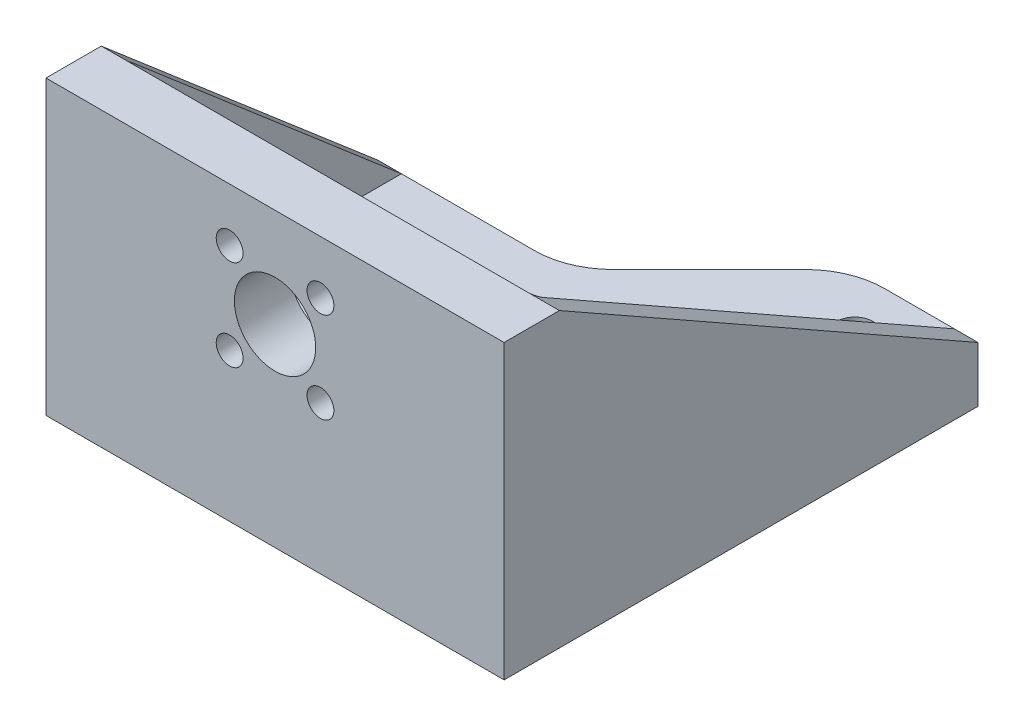
ISO-10303-21;
HEADER;
FILE_DESCRIPTION(('STEP AP214'),'2;1');
FILE_NAME('part.step','',(''),(''),'','','');
FILE_SCHEMA(('AUTOMOTIVE_DESIGN { 1 0 10303 214 1 1 1 1 }'));
ENDSEC;
DATA;
#1=APPLICATION_CONTEXT('core data for automotive mechanical design processes');
#2=APPLICATION_PROTOCOL_DEFINITION('international standard','automotive_design',2000,#1);
#3=PRODUCT_CONTEXT('',#1,'mechanical');
#4=PRODUCT('Part','Part','',(#3));
#5=PRODUCT_RELATED_PRODUCT_CATEGORY('part','',(#4));
#6=PRODUCT_DEFINITION_FORMATION('','',#4);
#7=PRODUCT_DEFINITION_CONTEXT('part definition',#1,'design');
#8=PRODUCT_DEFINITION('design','',#6,#7);
#9=PRODUCT_DEFINITION_SHAPE('','',#8);
#10=(LENGTH_UNIT() NAMED_UNIT(*) SI_UNIT(.MILLI.,.METRE.));
#11=(NAMED_UNIT(*) PLANE_ANGLE_UNIT() SI_UNIT($,.RADIAN.));
#12=(NAMED_UNIT(*) SI_UNIT($,.STERADIAN.) SOLID_ANGLE_UNIT());
#13=UNCERTAINTY_MEASURE_WITH_UNIT(LENGTH_MEASURE(1.E-05),#10,'distance_accuracy_value','');
#14=(GEOMETRIC_REPRESENTATION_CONTEXT(3) GLOBAL_UNCERTAINTY_ASSIGNED_CONTEXT((#13)) GLOBAL_UNIT_ASSIGNED_CONTEXT((#10,
#11,#12)) REPRESENTATION_CONTEXT('',''));
#15=CARTESIAN_POINT('',(0.,0.,0.));
#16=DIRECTION('',(0.,0.,1.));
#17=DIRECTION('',(1.,0.,0.));
#18=AXIS2_PLACEMENT_3D('',#15,#16,#17);
#19=CARTESIAN_POINT('',(0.,7.,0.));
#20=DIRECTION('',(0.,-1.,0.));
#21=DIRECTION('',(0.,0.,-1.));
#22=AXIS2_PLACEMENT_3D('',#19,#20,#21);
#23=PLANE('',#22);
#24=CARTESIAN_POINT('',(8.99999999999999,7.,-33.4));
#25=DIRECTION('',(0.,1.,0.));
#26=DIRECTION('',(0.,0.,1.));
#27=AXIS2_PLACEMENT_3D('',#24,#25,#26);
#28=CIRCLE('',#27,2.25);
#29=CARTESIAN_POINT('',(8.99999999999999,7.,-31.15));
#30=VERTEX_POINT('',#29);
#31=EDGE_CURVE('E655',#30,#30,#28,.T.);
#32=ORIENTED_EDGE('',*,*,#31,.F.);
#33=EDGE_LOOP('',(#32));
#34=FACE_BOUND('',#33,.T.);
#35=CARTESIAN_POINT('',(49.,7.,-13.4));
#36=DIRECTION('',(0.,1.,0.));
#37=DIRECTION('',(0.,0.,1.));
#38=AXIS2_PLACEMENT_3D('',#35,#36,#37);
#39=CIRCLE('',#38,2.25);
#40=CARTESIAN_POINT('',(49.,7.,-11.15));
#41=VERTEX_POINT('',#40);
#42=EDGE_CURVE('E647',#41,#41,#39,.T.);
#43=ORIENTED_EDGE('',*,*,#42,.F.);
#44=EDGE_LOOP('',(#43));
#45=FACE_BOUND('',#44,.T.);
#46=CARTESIAN_POINT('',(49.,7.,-53.4));
#47=DIRECTION('',(0.,1.,0.));
#48=DIRECTION('',(0.,0.,1.));
#49=AXIS2_PLACEMENT_3D('',#46,#47,#48);
#50=CIRCLE('',#49,2.25);
#51=CARTESIAN_POINT('',(49.,7.,-51.15));
#52=VERTEX_POINT('',#51);
#53=EDGE_CURVE('E639',#52,#52,#50,.T.);
#54=ORIENTED_EDGE('',*,*,#53,.F.);
#55=EDGE_LOOP('',(#54));
#56=FACE_BOUND('',#55,.T.);
#57=DIRECTION('',(0.,0.,1.));
#58=VECTOR('',#57,1.);
#59=CARTESIAN_POINT('',(3.,7.,-7.00000000000001));
#60=LINE('',#59,#58);
#61=CARTESIAN_POINT('',(3.,7.,-42.));
#62=VERTEX_POINT('',#61);
#63=CARTESIAN_POINT('',(3.,7.,-8.00000000000001));
#64=VERTEX_POINT('',#63);
#65=EDGE_CURVE('E151',#62,#64,#60,.T.);
#66=ORIENTED_EDGE('',*,*,#65,.T.);
#67=DIRECTION('',(-1.,0.,0.));
#68=VECTOR('',#67,1.);
#69=CARTESIAN_POINT('',(55.,7.,-8.));
#70=LINE('',#69,#68);
#71=CARTESIAN_POINT('',(55.,7.,-8.));
#72=VERTEX_POINT('',#71);
#73=EDGE_CURVE('E251',#64,#72,#70,.F.);
#74=ORIENTED_EDGE('',*,*,#73,.T.);
#75=DIRECTION('',(0.,0.,-1.));
#76=VECTOR('',#75,1.);
#77=CARTESIAN_POINT('',(55.,7.,-7.));
#78=LINE('',#77,#76);
#79=CARTESIAN_POINT('',(55.,7.,-60.));
#80=VERTEX_POINT('',#79);
#81=EDGE_CURVE('E291',#72,#80,#78,.T.);
#82=ORIENTED_EDGE('',*,*,#81,.T.);
#83=DIRECTION('',(-1.,0.,0.));
#84=VECTOR('',#83,1.);
#85=CARTESIAN_POINT('',(0.,7.,-60.));
#86=LINE('',#85,#84);
#87=CARTESIAN_POINT('',(46.142135623731,7.,-60.));
#88=VERTEX_POINT('',#87);
#89=EDGE_CURVE('E190',#80,#88,#86,.T.);
#90=ORIENTED_EDGE('',*,*,#89,.T.);
#91=CARTESIAN_POINT('',(46.142135623731,7.,-50.));
#92=DIRECTION('',(0.,-1.,0.));
#93=DIRECTION('',(0.,0.,-1.));
#94=AXIS2_PLACEMENT_3D('',#91,#92,#93);
#95=CIRCLE('',#94,10.);
#96=CARTESIAN_POINT('',(39.0710678118655,7.,-57.0710678118654));
#97=VERTEX_POINT('',#96);
#98=EDGE_CURVE('E216',#88,#97,#95,.F.);
#99=ORIENTED_EDGE('',*,*,#98,.T.);
#100=DIRECTION('',(0.707106781186541,0.,-0.707106781186554));
#101=VECTOR('',#100,1.);
#102=CARTESIAN_POINT('',(42.,7.,-60.));
#103=LINE('',#102,#101);
#104=CARTESIAN_POINT('',(26.9289321881349,7.,-44.9289321881346));
#105=VERTEX_POINT('',#104);
#106=EDGE_CURVE('E622',#105,#97,#103,.T.);
#107=ORIENTED_EDGE('',*,*,#106,.F.);
#108=CARTESIAN_POINT('',(19.8578643762693,7.,-52.));
#109=DIRECTION('',(0.,-1.,0.));
#110=DIRECTION('',(0.,0.,-1.));
#111=AXIS2_PLACEMENT_3D('',#108,#109,#110);
#112=CIRCLE('',#111,10.);
#113=CARTESIAN_POINT('',(19.8578643762693,7.,-42.));
#114=VERTEX_POINT('',#113);
#115=EDGE_CURVE('E232',#105,#114,#112,.T.);
#116=ORIENTED_EDGE('',*,*,#115,.T.);
#117=DIRECTION('',(1.,0.,0.));
#118=VECTOR('',#117,1.);
#119=CARTESIAN_POINT('',(24.0000000000003,7.,-42.));
#120=LINE('',#119,#118);
#121=EDGE_CURVE('E160',#62,#114,#120,.T.);
#122=ORIENTED_EDGE('',*,*,#121,.F.);
#123=EDGE_LOOP('',(#66,#74,#82,#90,#99,#107,#116,#122));
#124=FACE_BOUND('',#123,.T.);
#125=ADVANCED_FACE('F40',(#34,#45,#56,#124),#23,.F.);
#126=CARTESIAN_POINT('',(0.,37.,-7.00000000000001));
#127=DIRECTION('',(0.,0.,1.));
#128=DIRECTION('',(1.,0.,0.));
#129=AXIS2_PLACEMENT_3D('',#126,#127,#128);
#130=PLANE('',#129);
#131=CARTESIAN_POINT('',(29.,24.5,-7.00000000000001));
#132=DIRECTION('',(0.,0.,-1.));
#133=DIRECTION('',(-1.,0.,0.));
#134=AXIS2_PLACEMENT_3D('',#131,#132,#133);
#135=CIRCLE('',#134,5.15);
#136=CARTESIAN_POINT('',(23.85,24.5,-7.00000000000001));
#137=VERTEX_POINT('',#136);
#138=EDGE_CURVE('E176',#137,#137,#135,.T.);
#139=ORIENTED_EDGE('',*,*,#138,.F.);
#140=EDGE_LOOP('',(#139));
#141=FACE_BOUND('',#140,.T.);
#142=CARTESIAN_POINT('',(34.75,30.25,-7.00000000000001));
#143=DIRECTION('',(0.,0.,-1.));
#144=DIRECTION('',(-1.,0.,0.));
#145=AXIS2_PLACEMENT_3D('',#142,#143,#144);
#146=CIRCLE('',#145,1.7);
#147=CARTESIAN_POINT('',(33.05,30.25,-7.00000000000001));
#148=VERTEX_POINT('',#147);
#149=EDGE_CURVE('E324',#148,#148,#146,.T.);
#150=ORIENTED_EDGE('',*,*,#149,.F.);
#151=EDGE_LOOP('',(#150));
#152=FACE_BOUND('',#151,.T.);
#153=CARTESIAN_POINT('',(23.25,30.25,-7.00000000000001));
#154=DIRECTION('',(0.,0.,-1.));
#155=DIRECTION('',(-1.,0.,0.));
#156=AXIS2_PLACEMENT_3D('',#153,#154,#155);
#157=CIRCLE('',#156,1.7);
#158=CARTESIAN_POINT('',(21.55,30.25,-7.00000000000001));
#159=VERTEX_POINT('',#158);
#160=EDGE_CURVE('E316',#159,#159,#157,.T.);
#161=ORIENTED_EDGE('',*,*,#160,.F.);
#162=EDGE_LOOP('',(#161));
#163=FACE_BOUND('',#162,.T.);
#164=CARTESIAN_POINT('',(23.25,18.75,-7.00000000000001));
#165=DIRECTION('',(0.,0.,-1.));
#166=DIRECTION('',(-1.,0.,0.));
#167=AXIS2_PLACEMENT_3D('',#164,#165,#166);
#168=CIRCLE('',#167,1.7);
#169=CARTESIAN_POINT('',(21.55,18.75,-7.00000000000001));
#170=VERTEX_POINT('',#169);
#171=EDGE_CURVE('E308',#170,#170,#168,.T.);
#172=ORIENTED_EDGE('',*,*,#171,.F.);
#173=EDGE_LOOP('',(#172));
#174=FACE_BOUND('',#173,.T.);
#175=CARTESIAN_POINT('',(34.75,18.75,-7.00000000000001));
#176=DIRECTION('',(0.,0.,-1.));
#177=DIRECTION('',(-1.,0.,0.));
#178=AXIS2_PLACEMENT_3D('',#175,#176,#177);
#179=CIRCLE('',#178,1.7);
#180=CARTESIAN_POINT('',(33.05,18.75,-7.00000000000001));
#181=VERTEX_POINT('',#180);
#182=EDGE_CURVE('E290',#181,#181,#179,.T.);
#183=ORIENTED_EDGE('',*,*,#182,.F.);
#184=EDGE_LOOP('',(#183));
#185=FACE_BOUND('',#184,.T.);
#186=DIRECTION('',(-1.,0.,0.));
#187=VECTOR('',#186,1.);
#188=CARTESIAN_POINT('',(0.,37.,-7.00000000000001));
#189=LINE('',#188,#187);
#190=CARTESIAN_POINT('',(54.,37.,-7.));
#191=VERTEX_POINT('',#190);
#192=CARTESIAN_POINT('',(4.,37.,-7.00000000000001));
#193=VERTEX_POINT('',#192);
#194=EDGE_CURVE('E157',#191,#193,#189,.T.);
#195=ORIENTED_EDGE('',*,*,#194,.F.);
#196=DIRECTION('',(0.,-1.,0.));
#197=VECTOR('',#196,1.);
#198=CARTESIAN_POINT('',(54.,37.,-7.));
#199=LINE('',#198,#197);
#200=CARTESIAN_POINT('',(54.,8.,-7.));
#201=VERTEX_POINT('',#200);
#202=EDGE_CURVE('E244',#191,#201,#199,.T.);
#203=ORIENTED_EDGE('',*,*,#202,.T.);
#204=DIRECTION('',(-1.,0.,0.));
#205=VECTOR('',#204,1.);
#206=CARTESIAN_POINT('',(3.,8.,-7.00000000000001));
#207=LINE('',#206,#205);
#208=CARTESIAN_POINT('',(4.,8.,-7.00000000000001));
#209=VERTEX_POINT('',#208);
#210=EDGE_CURVE('E241',#201,#209,#207,.T.);
#211=ORIENTED_EDGE('',*,*,#210,.T.);
#212=DIRECTION('',(0.,1.,0.));
#213=VECTOR('',#212,1.);
#214=CARTESIAN_POINT('',(4.,37.,-7.00000000000001));
#215=LINE('',#214,#213);
#216=EDGE_CURVE('E238',#209,#193,#215,.T.);
#217=ORIENTED_EDGE('',*,*,#216,.T.);
#218=EDGE_LOOP('',(#195,#203,#211,#217));
#219=FACE_BOUND('',#218,.T.);
#220=ADVANCED_FACE('F276',(#141,#152,#163,#174,#185,#219),#130,.F.);
#221=CARTESIAN_POINT('',(0.,7.,0.));
#222=DIRECTION('',(1.,0.,0.));
#223=DIRECTION('',(0.,0.,-1.));
#224=AXIS2_PLACEMENT_3D('',#221,#222,#223);
#225=PLANE('',#224);
#226=DIRECTION('',(0.,-0.650791373455969,-0.759256602365296));
#227=VECTOR('',#226,1.);
#228=CARTESIAN_POINT('',(0.,7.,-42.));
#229=LINE('',#228,#227);
#230=CARTESIAN_POINT('',(0.,37.,-7.00000000000001));
#231=VERTEX_POINT('',#230);
#232=CARTESIAN_POINT('',(0.,7.,-42.));
#233=VERTEX_POINT('',#232);
#234=EDGE_CURVE('E139',#231,#233,#229,.T.);
#235=ORIENTED_EDGE('',*,*,#234,.T.);
#236=DIRECTION('',(0.,1.,0.));
#237=VECTOR('',#236,1.);
#238=CARTESIAN_POINT('',(0.,0.,-42.));
#239=LINE('',#238,#237);
#240=CARTESIAN_POINT('',(0.,0.,-42.));
#241=VERTEX_POINT('',#240);
#242=EDGE_CURVE('E636',#241,#233,#239,.T.);
#243=ORIENTED_EDGE('',*,*,#242,.F.);
#244=DIRECTION('',(0.,0.,1.));
#245=VECTOR('',#244,1.);
#246=CARTESIAN_POINT('',(0.,0.,0.));
#247=LINE('',#246,#245);
#248=CARTESIAN_POINT('',(0.,0.,0.));
#249=VERTEX_POINT('',#248);
#250=EDGE_CURVE('E184',#241,#249,#247,.T.);
#251=ORIENTED_EDGE('',*,*,#250,.T.);
#252=DIRECTION('',(0.,-1.,0.));
#253=VECTOR('',#252,1.);
#254=CARTESIAN_POINT('',(0.,7.,0.));
#255=LINE('',#254,#253);
#256=CARTESIAN_POINT('',(0.,37.,0.));
#257=VERTEX_POINT('',#256);
#258=EDGE_CURVE('E165',#257,#249,#255,.T.);
#259=ORIENTED_EDGE('',*,*,#258,.F.);
#260=DIRECTION('',(0.,0.,1.));
#261=VECTOR('',#260,1.);
#262=CARTESIAN_POINT('',(0.,37.,-7.00000000000001));
#263=LINE('',#262,#261);
#264=EDGE_CURVE('E156',#231,#257,#263,.T.);
#265=ORIENTED_EDGE('',*,*,#264,.F.);
#266=EDGE_LOOP('',(#235,#243,#251,#259,#265));
#267=FACE_BOUND('',#266,.T.);
#268=ADVANCED_FACE('F163',(#267),#225,.F.);
#269=CARTESIAN_POINT('',(0.,7.,0.));
#270=DIRECTION('',(0.,0.,-1.));
#271=DIRECTION('',(-1.,0.,0.));
#272=AXIS2_PLACEMENT_3D('',#269,#270,#271);
#273=PLANE('',#272);
#274=CARTESIAN_POINT('',(34.75,18.75,0.));
#275=DIRECTION('',(0.,0.,-1.));
#276=DIRECTION('',(-1.,0.,0.));
#277=AXIS2_PLACEMENT_3D('',#274,#275,#276);
#278=CIRCLE('',#277,1.7);
#279=CARTESIAN_POINT('',(33.05,18.75,0.));
#280=VERTEX_POINT('',#279);
#281=EDGE_CURVE('E296',#280,#280,#278,.T.);
#282=ORIENTED_EDGE('',*,*,#281,.T.);
#283=EDGE_LOOP('',(#282));
#284=FACE_BOUND('',#283,.T.);
#285=CARTESIAN_POINT('',(23.25,18.75,0.));
#286=DIRECTION('',(0.,0.,-1.));
#287=DIRECTION('',(-1.,0.,0.));
#288=AXIS2_PLACEMENT_3D('',#285,#286,#287);
#289=CIRCLE('',#288,1.7);
#290=CARTESIAN_POINT('',(21.55,18.75,0.));
#291=VERTEX_POINT('',#290);
#292=EDGE_CURVE('E312',#291,#291,#289,.T.);
#293=ORIENTED_EDGE('',*,*,#292,.T.);
#294=EDGE_LOOP('',(#293));
#295=FACE_BOUND('',#294,.T.);
#296=CARTESIAN_POINT('',(23.25,30.25,0.));
#297=DIRECTION('',(0.,0.,-1.));
#298=DIRECTION('',(-1.,0.,0.));
#299=AXIS2_PLACEMENT_3D('',#296,#297,#298);
#300=CIRCLE('',#299,1.7);
#301=CARTESIAN_POINT('',(21.55,30.25,0.));
#302=VERTEX_POINT('',#301);
#303=EDGE_CURVE('E320',#302,#302,#300,.T.);
#304=ORIENTED_EDGE('',*,*,#303,.T.);
#305=EDGE_LOOP('',(#304));
#306=FACE_BOUND('',#305,.T.);
#307=CARTESIAN_POINT('',(34.75,30.25,0.));
#308=DIRECTION('',(0.,0.,-1.));
#309=DIRECTION('',(-1.,0.,0.));
#310=AXIS2_PLACEMENT_3D('',#307,#308,#309);
#311=CIRCLE('',#310,1.7);
#312=CARTESIAN_POINT('',(33.05,30.25,0.));
#313=VERTEX_POINT('',#312);
#314=EDGE_CURVE('E328',#313,#313,#311,.T.);
#315=ORIENTED_EDGE('',*,*,#314,.T.);
#316=EDGE_LOOP('',(#315));
#317=FACE_BOUND('',#316,.T.);
#318=CARTESIAN_POINT('',(29.,24.5,0.));
#319=DIRECTION('',(0.,0.,-1.));
#320=DIRECTION('',(-1.,0.,0.));
#321=AXIS2_PLACEMENT_3D('',#318,#319,#320);
#322=CIRCLE('',#321,5.15);
#323=CARTESIAN_POINT('',(23.85,24.5,0.));
#324=VERTEX_POINT('',#323);
#325=EDGE_CURVE('E169',#324,#324,#322,.T.);
#326=ORIENTED_EDGE('',*,*,#325,.T.);
#327=EDGE_LOOP('',(#326));
#328=FACE_BOUND('',#327,.T.);
#329=DIRECTION('',(1.,0.,0.));
#330=VECTOR('',#329,1.);
#331=CARTESIAN_POINT('',(0.,0.,0.));
#332=LINE('',#331,#330);
#333=CARTESIAN_POINT('',(58.,0.,0.));
#334=VERTEX_POINT('',#333);
#335=EDGE_CURVE('E193',#249,#334,#332,.T.);
#336=ORIENTED_EDGE('',*,*,#335,.T.);
#337=DIRECTION('',(0.,-1.,0.));
#338=VECTOR('',#337,1.);
#339=CARTESIAN_POINT('',(58.,7.,0.));
#340=LINE('',#339,#338);
#341=CARTESIAN_POINT('',(58.,37.,0.));
#342=VERTEX_POINT('',#341);
#343=EDGE_CURVE('E206',#342,#334,#340,.T.);
#344=ORIENTED_EDGE('',*,*,#343,.F.);
#345=DIRECTION('',(1.,0.,0.));
#346=VECTOR('',#345,1.);
#347=CARTESIAN_POINT('',(0.,37.,0.));
#348=LINE('',#347,#346);
#349=EDGE_CURVE('E168',#257,#342,#348,.T.);
#350=ORIENTED_EDGE('',*,*,#349,.F.);
#351=ORIENTED_EDGE('',*,*,#258,.T.);
#352=EDGE_LOOP('',(#336,#344,#350,#351));
#353=FACE_BOUND('',#352,.T.);
#354=ADVANCED_FACE('F385',(#284,#295,#306,#317,#328,#353),#273,.F.);
#355=CARTESIAN_POINT('',(58.,7.,0.));
#356=DIRECTION('',(-1.,0.,0.));
#357=DIRECTION('',(0.,0.,1.));
#358=AXIS2_PLACEMENT_3D('',#355,#356,#357);
#359=PLANE('',#358);
#360=DIRECTION('',(0.,-1.,0.));
#361=VECTOR('',#360,1.);
#362=CARTESIAN_POINT('',(58.,7.,-60.));
#363=LINE('',#362,#361);
#364=CARTESIAN_POINT('',(58.,7.,-60.));
#365=VERTEX_POINT('',#364);
#366=CARTESIAN_POINT('',(58.,0.,-60.));
#367=VERTEX_POINT('',#366);
#368=EDGE_CURVE('E189',#365,#367,#363,.T.);
#369=ORIENTED_EDGE('',*,*,#368,.F.);
#370=DIRECTION('',(0.,0.49259821985177,0.87025685507146));
#371=VECTOR('',#370,1.);
#372=CARTESIAN_POINT('',(58.,7.,-60.));
#373=LINE('',#372,#371);
#374=CARTESIAN_POINT('',(58.,37.,-7.));
#375=VERTEX_POINT('',#374);
#376=EDGE_CURVE('E298',#365,#375,#373,.T.);
#377=ORIENTED_EDGE('',*,*,#376,.T.);
#378=DIRECTION('',(0.,0.,-1.));
#379=VECTOR('',#378,1.);
#380=CARTESIAN_POINT('',(58.,37.,-7.));
#381=LINE('',#380,#379);
#382=EDGE_CURVE('E173',#342,#375,#381,.T.);
#383=ORIENTED_EDGE('',*,*,#382,.F.);
#384=ORIENTED_EDGE('',*,*,#343,.T.);
#385=DIRECTION('',(0.,0.,-1.));
#386=VECTOR('',#385,1.);
#387=CARTESIAN_POINT('',(58.,0.,0.));
#388=LINE('',#387,#386);
#389=EDGE_CURVE('E196',#334,#367,#388,.T.);
#390=ORIENTED_EDGE('',*,*,#389,.T.);
#391=EDGE_LOOP('',(#369,#377,#383,#384,#390));
#392=FACE_BOUND('',#391,.T.);
#393=ADVANCED_FACE('F381',(#392),#359,.F.);
#394=CARTESIAN_POINT('',(0.,7.,-60.));
#395=DIRECTION('',(0.,0.,1.));
#396=DIRECTION('',(1.,0.,0.));
#397=AXIS2_PLACEMENT_3D('',#394,#395,#396);
#398=PLANE('',#397);
#399=DIRECTION('',(-1.,0.,0.));
#400=VECTOR('',#399,1.);
#401=CARTESIAN_POINT('',(0.,0.,-60.));
#402=LINE('',#401,#400);
#403=CARTESIAN_POINT('',(46.142135623731,0.,-60.));
#404=VERTEX_POINT('',#403);
#405=EDGE_CURVE('E199',#367,#404,#402,.T.);
#406=ORIENTED_EDGE('',*,*,#405,.T.);
#407=DIRECTION('',(0.,1.,0.));
#408=VECTOR('',#407,1.);
#409=CARTESIAN_POINT('',(46.142135623731,7.,-60.));
#410=LINE('',#409,#408);
#411=EDGE_CURVE('E212',#404,#88,#410,.T.);
#412=ORIENTED_EDGE('',*,*,#411,.T.);
#413=ORIENTED_EDGE('',*,*,#89,.F.);
#414=EDGE_CURVE('E185',#365,#80,#86,.T.);
#415=ORIENTED_EDGE('',*,*,#414,.F.);
#416=ORIENTED_EDGE('',*,*,#368,.T.);
#417=EDGE_LOOP('',(#406,#412,#413,#415,#416));
#418=FACE_BOUND('',#417,.T.);
#419=ADVANCED_FACE('F377',(#418),#398,.F.);
#420=CARTESIAN_POINT('',(0.,0.,0.));
#421=DIRECTION('',(0.,-1.,0.));
#422=DIRECTION('',(0.,0.,-1.));
#423=AXIS2_PLACEMENT_3D('',#420,#421,#422);
#424=PLANE('',#423);
#425=DIRECTION('',(0.707106781186541,0.,-0.707106781186554));
#426=VECTOR('',#425,1.);
#427=CARTESIAN_POINT('',(42.,0.,-60.));
#428=LINE('',#427,#426);
#429=CARTESIAN_POINT('',(26.9289321881349,0.,-44.9289321881346));
#430=VERTEX_POINT('',#429);
#431=CARTESIAN_POINT('',(39.0710678118655,0.,-57.0710678118654));
#432=VERTEX_POINT('',#431);
#433=EDGE_CURVE('E631',#430,#432,#428,.T.);
#434=ORIENTED_EDGE('',*,*,#433,.T.);
#435=CARTESIAN_POINT('',(46.142135623731,0.,-50.));
#436=DIRECTION('',(0.,-1.,0.));
#437=DIRECTION('',(0.,0.,-1.));
#438=AXIS2_PLACEMENT_3D('',#435,#436,#437);
#439=CIRCLE('',#438,10.);
#440=EDGE_CURVE('E226',#432,#404,#439,.T.);
#441=ORIENTED_EDGE('',*,*,#440,.T.);
#442=ORIENTED_EDGE('',*,*,#405,.F.);
#443=ORIENTED_EDGE('',*,*,#389,.F.);
#444=ORIENTED_EDGE('',*,*,#335,.F.);
#445=ORIENTED_EDGE('',*,*,#250,.F.);
#446=DIRECTION('',(1.,0.,0.));
#447=VECTOR('',#446,1.);
#448=CARTESIAN_POINT('',(24.0000000000003,0.,-42.));
#449=LINE('',#448,#447);
#450=CARTESIAN_POINT('',(19.8578643762693,0.,-42.));
#451=VERTEX_POINT('',#450);
#452=EDGE_CURVE('E626',#241,#451,#449,.T.);
#453=ORIENTED_EDGE('',*,*,#452,.T.);
#454=CARTESIAN_POINT('',(19.8578643762693,0.,-52.));
#455=DIRECTION('',(0.,-1.,0.));
#456=DIRECTION('',(0.,0.,-1.));
#457=AXIS2_PLACEMENT_3D('',#454,#455,#456);
#458=CIRCLE('',#457,10.);
#459=EDGE_CURVE('E235',#451,#430,#458,.F.);
#460=ORIENTED_EDGE('',*,*,#459,.T.);
#461=EDGE_LOOP('',(#434,#441,#442,#443,#444,#445,#453,#460));
#462=FACE_BOUND('',#461,.T.);
#463=CARTESIAN_POINT('',(49.,0.,-53.4));
#464=DIRECTION('',(0.,1.,0.));
#465=DIRECTION('',(0.,0.,1.));
#466=AXIS2_PLACEMENT_3D('',#463,#464,#465);
#467=CIRCLE('',#466,2.25);
#468=CARTESIAN_POINT('',(49.,0.,-51.15));
#469=VERTEX_POINT('',#468);
#470=EDGE_CURVE('E643',#469,#469,#467,.T.);
#471=ORIENTED_EDGE('',*,*,#470,.T.);
#472=EDGE_LOOP('',(#471));
#473=FACE_BOUND('',#472,.T.);
#474=CARTESIAN_POINT('',(49.,0.,-13.4));
#475=DIRECTION('',(0.,1.,0.));
#476=DIRECTION('',(0.,0.,1.));
#477=AXIS2_PLACEMENT_3D('',#474,#475,#476);
#478=CIRCLE('',#477,2.25);
#479=CARTESIAN_POINT('',(49.,0.,-11.15));
#480=VERTEX_POINT('',#479);
#481=EDGE_CURVE('E651',#480,#480,#478,.T.);
#482=ORIENTED_EDGE('',*,*,#481,.T.);
#483=EDGE_LOOP('',(#482));
#484=FACE_BOUND('',#483,.T.);
#485=CARTESIAN_POINT('',(8.99999999999999,0.,-33.4));
#486=DIRECTION('',(0.,1.,0.));
#487=DIRECTION('',(0.,0.,1.));
#488=AXIS2_PLACEMENT_3D('',#485,#486,#487);
#489=CIRCLE('',#488,2.25);
#490=CARTESIAN_POINT('',(8.99999999999999,0.,-31.15));
#491=VERTEX_POINT('',#490);
#492=EDGE_CURVE('E303',#491,#491,#489,.T.);
#493=ORIENTED_EDGE('',*,*,#492,.T.);
#494=EDGE_LOOP('',(#493));
#495=FACE_BOUND('',#494,.T.);
#496=ADVANCED_FACE('F374',(#462,#473,#484,#495),#424,.T.);
#497=CARTESIAN_POINT('',(0.,37.,0.));
#498=DIRECTION('',(0.,1.,0.));
#499=DIRECTION('',(0.,0.,1.));
#500=AXIS2_PLACEMENT_3D('',#497,#498,#499);
#501=PLANE('',#500);
#502=ORIENTED_EDGE('',*,*,#264,.T.);
#503=ORIENTED_EDGE('',*,*,#349,.T.);
#504=ORIENTED_EDGE('',*,*,#382,.T.);
#505=EDGE_CURVE('E59',#375,#191,#189,.T.);
#506=ORIENTED_EDGE('',*,*,#505,.T.);
#507=ORIENTED_EDGE('',*,*,#194,.T.);
#508=DIRECTION('',(-1.,0.,0.));
#509=VECTOR('',#508,1.);
#510=CARTESIAN_POINT('',(3.,37.,-7.00000000000001));
#511=LINE('',#510,#509);
#512=EDGE_CURVE('E142',#193,#231,#511,.T.);
#513=ORIENTED_EDGE('',*,*,#512,.T.);
#514=EDGE_LOOP('',(#502,#503,#504,#506,#507,#513));
#515=FACE_BOUND('',#514,.T.);
#516=ADVANCED_FACE('F154',(#515),#501,.T.);
#517=CARTESIAN_POINT('',(29.,24.5,0.));
#518=DIRECTION('',(0.,0.,-1.));
#519=DIRECTION('',(-1.,0.,0.));
#520=AXIS2_PLACEMENT_3D('',#517,#518,#519);
#521=CYLINDRICAL_SURFACE('',#520,5.15);
#522=ORIENTED_EDGE('',*,*,#325,.F.);
#523=EDGE_LOOP('',(#522));
#524=FACE_BOUND('',#523,.T.);
#525=ORIENTED_EDGE('',*,*,#138,.T.);
#526=EDGE_LOOP('',(#525));
#527=FACE_BOUND('',#526,.T.);
#528=ADVANCED_FACE('F337',(#524,#527),#521,.F.);
#529=CARTESIAN_POINT('',(34.75,30.25,-7.00000000000001));
#530=DIRECTION('',(0.,0.,-1.));
#531=DIRECTION('',(-1.,0.,0.));
#532=AXIS2_PLACEMENT_3D('',#529,#530,#531);
#533=CYLINDRICAL_SURFACE('',#532,1.7);
#534=ORIENTED_EDGE('',*,*,#314,.F.);
#535=EDGE_LOOP('',(#534));
#536=FACE_BOUND('',#535,.T.);
#537=ORIENTED_EDGE('',*,*,#149,.T.);
#538=EDGE_LOOP('',(#537));
#539=FACE_BOUND('',#538,.T.);
#540=ADVANCED_FACE('F560',(#536,#539),#533,.F.);
#541=CARTESIAN_POINT('',(23.25,30.25,-7.00000000000001));
#542=DIRECTION('',(0.,0.,-1.));
#543=DIRECTION('',(-1.,0.,0.));
#544=AXIS2_PLACEMENT_3D('',#541,#542,#543);
#545=CYLINDRICAL_SURFACE('',#544,1.7);
#546=ORIENTED_EDGE('',*,*,#303,.F.);
#547=EDGE_LOOP('',(#546));
#548=FACE_BOUND('',#547,.T.);
#549=ORIENTED_EDGE('',*,*,#160,.T.);
#550=EDGE_LOOP('',(#549));
#551=FACE_BOUND('',#550,.T.);
#552=ADVANCED_FACE('F361',(#548,#551),#545,.F.);
#553=CARTESIAN_POINT('',(23.25,18.75,-7.00000000000001));
#554=DIRECTION('',(0.,0.,-1.));
#555=DIRECTION('',(-1.,0.,0.));
#556=AXIS2_PLACEMENT_3D('',#553,#554,#555);
#557=CYLINDRICAL_SURFACE('',#556,1.7);
#558=ORIENTED_EDGE('',*,*,#292,.F.);
#559=EDGE_LOOP('',(#558));
#560=FACE_BOUND('',#559,.T.);
#561=ORIENTED_EDGE('',*,*,#171,.T.);
#562=EDGE_LOOP('',(#561));
#563=FACE_BOUND('',#562,.T.);
#564=ADVANCED_FACE('F352',(#560,#563),#557,.F.);
#565=CARTESIAN_POINT('',(34.75,18.75,-7.00000000000001));
#566=DIRECTION('',(0.,0.,-1.));
#567=DIRECTION('',(-1.,0.,0.));
#568=AXIS2_PLACEMENT_3D('',#565,#566,#567);
#569=CYLINDRICAL_SURFACE('',#568,1.7);
#570=ORIENTED_EDGE('',*,*,#281,.F.);
#571=EDGE_LOOP('',(#570));
#572=FACE_BOUND('',#571,.T.);
#573=ORIENTED_EDGE('',*,*,#182,.T.);
#574=EDGE_LOOP('',(#573));
#575=FACE_BOUND('',#574,.T.);
#576=ADVANCED_FACE('F350',(#572,#575),#569,.F.);
#577=CARTESIAN_POINT('',(55.,7.,-60.));
#578=DIRECTION('',(0.,0.87025685507146,-0.49259821985177));
#579=DIRECTION('',(0.,0.49259821985177,0.87025685507146));
#580=AXIS2_PLACEMENT_3D('',#577,#578,#579);
#581=PLANE('',#580);
#582=ORIENTED_EDGE('',*,*,#376,.F.);
#583=ORIENTED_EDGE('',*,*,#414,.T.);
#584=DIRECTION('',(0.,0.49259821985177,0.87025685507146));
#585=VECTOR('',#584,1.);
#586=CARTESIAN_POINT('',(55.,7.,-60.));
#587=LINE('',#586,#585);
#588=CARTESIAN_POINT('',(55.,36.4339622641509,-8.00000000000001));
#589=VERTEX_POINT('',#588);
#590=EDGE_CURVE('E284',#80,#589,#587,.T.);
#591=ORIENTED_EDGE('',*,*,#590,.T.);
#592=CARTESIAN_POINT('',(54.,36.4339622641509,-8.));
#593=DIRECTION('',(0.,0.87025685507146,-0.49259821985177));
#594=DIRECTION('',(0.,-0.49259821985177,-0.87025685507146));
#595=AXIS2_PLACEMENT_3D('',#592,#593,#594);
#596=ELLIPSE('',#595,1.14908603611963,1.);
#597=EDGE_CURVE('E51',#589,#191,#596,.F.);
#598=ORIENTED_EDGE('',*,*,#597,.T.);
#599=ORIENTED_EDGE('',*,*,#505,.F.);
#600=EDGE_LOOP('',(#582,#583,#591,#598,#599));
#601=FACE_BOUND('',#600,.T.);
#602=ADVANCED_FACE('F281',(#601),#581,.T.);
#603=CARTESIAN_POINT('',(55.,0.,0.));
#604=DIRECTION('',(-1.,0.,0.));
#605=DIRECTION('',(0.,0.,1.));
#606=AXIS2_PLACEMENT_3D('',#603,#604,#605);
#607=PLANE('',#606);
#608=ORIENTED_EDGE('',*,*,#81,.F.);
#609=DIRECTION('',(0.,-1.,0.));
#610=VECTOR('',#609,1.);
#611=CARTESIAN_POINT('',(55.,0.,-8.));
#612=LINE('',#611,#610);
#613=EDGE_CURVE('E248',#72,#589,#612,.F.);
#614=ORIENTED_EDGE('',*,*,#613,.T.);
#615=ORIENTED_EDGE('',*,*,#590,.F.);
#616=EDGE_LOOP('',(#608,#614,#615));
#617=FACE_BOUND('',#616,.T.);
#618=ADVANCED_FACE('F359',(#617),#607,.T.);
#619=CARTESIAN_POINT('',(8.99999999999999,7.,-33.4));
#620=DIRECTION('',(0.,1.,0.));
#621=DIRECTION('',(0.,0.,1.));
#622=AXIS2_PLACEMENT_3D('',#619,#620,#621);
#623=CYLINDRICAL_SURFACE('',#622,2.25);
#624=ORIENTED_EDGE('',*,*,#492,.F.);
#625=EDGE_LOOP('',(#624));
#626=FACE_BOUND('',#625,.T.);
#627=ORIENTED_EDGE('',*,*,#31,.T.);
#628=EDGE_LOOP('',(#627));
#629=FACE_BOUND('',#628,.T.);
#630=ADVANCED_FACE('F463',(#626,#629),#623,.F.);
#631=CARTESIAN_POINT('',(49.,7.,-13.4));
#632=DIRECTION('',(0.,1.,0.));
#633=DIRECTION('',(0.,0.,1.));
#634=AXIS2_PLACEMENT_3D('',#631,#632,#633);
#635=CYLINDRICAL_SURFACE('',#634,2.25);
#636=ORIENTED_EDGE('',*,*,#481,.F.);
#637=EDGE_LOOP('',(#636));
#638=FACE_BOUND('',#637,.T.);
#639=ORIENTED_EDGE('',*,*,#42,.T.);
#640=EDGE_LOOP('',(#639));
#641=FACE_BOUND('',#640,.T.);
#642=ADVANCED_FACE('F454',(#638,#641),#635,.F.);
#643=CARTESIAN_POINT('',(49.,7.,-53.4));
#644=DIRECTION('',(0.,1.,0.));
#645=DIRECTION('',(0.,0.,1.));
#646=AXIS2_PLACEMENT_3D('',#643,#644,#645);
#647=CYLINDRICAL_SURFACE('',#646,2.25);
#648=ORIENTED_EDGE('',*,*,#470,.F.);
#649=EDGE_LOOP('',(#648));
#650=FACE_BOUND('',#649,.T.);
#651=ORIENTED_EDGE('',*,*,#53,.T.);
#652=EDGE_LOOP('',(#651));
#653=FACE_BOUND('',#652,.T.);
#654=ADVANCED_FACE('F445',(#650,#653),#647,.F.);
#655=CARTESIAN_POINT('',(42.,0.,-60.));
#656=DIRECTION('',(0.707106781186554,0.,0.707106781186541));
#657=DIRECTION('',(0.707106781186541,0.,-0.707106781186554));
#658=AXIS2_PLACEMENT_3D('',#655,#656,#657);
#659=PLANE('',#658);
#660=ORIENTED_EDGE('',*,*,#106,.T.);
#661=DIRECTION('',(0.,1.,0.));
#662=VECTOR('',#661,1.);
#663=CARTESIAN_POINT('',(39.0710678118655,0.,-57.0710678118654));
#664=LINE('',#663,#662);
#665=EDGE_CURVE('E223',#97,#432,#664,.F.);
#666=ORIENTED_EDGE('',*,*,#665,.T.);
#667=ORIENTED_EDGE('',*,*,#433,.F.);
#668=DIRECTION('',(0.,1.,0.));
#669=VECTOR('',#668,1.);
#670=CARTESIAN_POINT('',(26.9289321881349,7.,-44.9289321881346));
#671=LINE('',#670,#669);
#672=EDGE_CURVE('E219',#430,#105,#671,.T.);
#673=ORIENTED_EDGE('',*,*,#672,.T.);
#674=EDGE_LOOP('',(#660,#666,#667,#673));
#675=FACE_BOUND('',#674,.T.);
#676=ADVANCED_FACE('F437',(#675),#659,.F.);
#677=CARTESIAN_POINT('',(24.0000000000003,0.,-42.));
#678=DIRECTION('',(0.,0.,1.));
#679=DIRECTION('',(1.,0.,0.));
#680=AXIS2_PLACEMENT_3D('',#677,#678,#679);
#681=PLANE('',#680);
#682=ORIENTED_EDGE('',*,*,#121,.T.);
#683=DIRECTION('',(0.,1.,0.));
#684=VECTOR('',#683,1.);
#685=CARTESIAN_POINT('',(19.8578643762693,0.,-42.));
#686=LINE('',#685,#684);
#687=EDGE_CURVE('E229',#114,#451,#686,.F.);
#688=ORIENTED_EDGE('',*,*,#687,.T.);
#689=ORIENTED_EDGE('',*,*,#452,.F.);
#690=ORIENTED_EDGE('',*,*,#242,.T.);
#691=EDGE_CURVE('E145',#233,#62,#120,.T.);
#692=ORIENTED_EDGE('',*,*,#691,.T.);
#693=EDGE_LOOP('',(#682,#688,#689,#690,#692));
#694=FACE_BOUND('',#693,.T.);
#695=ADVANCED_FACE('F430',(#694),#681,.F.);
#696=CARTESIAN_POINT('',(3.,7.,-42.));
#697=DIRECTION('',(0.,0.759256602365297,-0.650791373455969));
#698=DIRECTION('',(0.,0.650791373455969,0.759256602365297));
#699=AXIS2_PLACEMENT_3D('',#696,#697,#698);
#700=PLANE('',#699);
#701=ORIENTED_EDGE('',*,*,#234,.F.);
#702=ORIENTED_EDGE('',*,*,#512,.F.);
#703=CARTESIAN_POINT('',(4.,36.1428571428571,-8.00000000000001));
#704=DIRECTION('',(0.,0.759256602365297,-0.650791373455969));
#705=DIRECTION('',(0.,-0.650791373455969,-0.759256602365297));
#706=AXIS2_PLACEMENT_3D('',#703,#704,#705);
#707=ELLIPSE('',#706,1.31707777961327,1.);
#708=CARTESIAN_POINT('',(3.,36.1428571428571,-8.00000000000001));
#709=VERTEX_POINT('',#708);
#710=EDGE_CURVE('E12',#193,#709,#707,.F.);
#711=ORIENTED_EDGE('',*,*,#710,.T.);
#712=DIRECTION('',(0.,-0.650791373455969,-0.759256602365296));
#713=VECTOR('',#712,1.);
#714=CARTESIAN_POINT('',(3.,7.,-42.));
#715=LINE('',#714,#713);
#716=EDGE_CURVE('E161',#709,#62,#715,.T.);
#717=ORIENTED_EDGE('',*,*,#716,.T.);
#718=ORIENTED_EDGE('',*,*,#691,.F.);
#719=EDGE_LOOP('',(#701,#702,#711,#717,#718));
#720=FACE_BOUND('',#719,.T.);
#721=ADVANCED_FACE('F141',(#720),#700,.T.);
#722=CARTESIAN_POINT('',(3.,0.,0.));
#723=DIRECTION('',(-1.,0.,0.));
#724=DIRECTION('',(0.,0.,1.));
#725=AXIS2_PLACEMENT_3D('',#722,#723,#724);
#726=PLANE('',#725);
#727=ORIENTED_EDGE('',*,*,#716,.F.);
#728=DIRECTION('',(0.,1.,0.));
#729=VECTOR('',#728,1.);
#730=CARTESIAN_POINT('',(3.,7.,-8.00000000000001));
#731=LINE('',#730,#729);
#732=EDGE_CURVE('E254',#709,#64,#731,.F.);
#733=ORIENTED_EDGE('',*,*,#732,.T.);
#734=ORIENTED_EDGE('',*,*,#65,.F.);
#735=EDGE_LOOP('',(#727,#733,#734));
#736=FACE_BOUND('',#735,.T.);
#737=ADVANCED_FACE('F396',(#736),#726,.F.);
#738=CARTESIAN_POINT('',(46.142135623731,7.,-50.));
#739=DIRECTION('',(0.,1.,0.));
#740=DIRECTION('',(0.,0.,1.));
#741=AXIS2_PLACEMENT_3D('',#738,#739,#740);
#742=CYLINDRICAL_SURFACE('',#741,10.);
#743=ORIENTED_EDGE('',*,*,#440,.F.);
#744=ORIENTED_EDGE('',*,*,#665,.F.);
#745=ORIENTED_EDGE('',*,*,#98,.F.);
#746=ORIENTED_EDGE('',*,*,#411,.F.);
#747=EDGE_LOOP('',(#743,#744,#745,#746));
#748=FACE_BOUND('',#747,.T.);
#749=ADVANCED_FACE('F392',(#748),#742,.T.);
#750=CARTESIAN_POINT('',(19.8578643762693,0.,-52.));
#751=DIRECTION('',(0.,-1.,0.));
#752=DIRECTION('',(0.,0.,-1.));
#753=AXIS2_PLACEMENT_3D('',#750,#751,#752);
#754=CYLINDRICAL_SURFACE('',#753,10.);
#755=ORIENTED_EDGE('',*,*,#459,.F.);
#756=ORIENTED_EDGE('',*,*,#687,.F.);
#757=ORIENTED_EDGE('',*,*,#115,.F.);
#758=ORIENTED_EDGE('',*,*,#672,.F.);
#759=EDGE_LOOP('',(#755,#756,#757,#758));
#760=FACE_BOUND('',#759,.T.);
#761=ADVANCED_FACE('F395',(#760),#754,.F.);
#762=CARTESIAN_POINT('',(4.,37.,-8.00000000000001));
#763=DIRECTION('',(0.,-1.,0.));
#764=DIRECTION('',(0.,0.,-1.));
#765=AXIS2_PLACEMENT_3D('',#762,#763,#764);
#766=CYLINDRICAL_SURFACE('',#765,1.);
#767=ORIENTED_EDGE('',*,*,#710,.F.);
#768=ORIENTED_EDGE('',*,*,#216,.F.);
#769=CARTESIAN_POINT('',(4.,8.,-8.00000000000001));
#770=DIRECTION('',(0.707106781186547,-0.707106781186547,0.));
#771=DIRECTION('',(0.707106781186547,0.707106781186547,0.));
#772=AXIS2_PLACEMENT_3D('',#769,#770,#771);
#773=ELLIPSE('',#772,1.41421356237309,1.);
#774=EDGE_CURVE('E44',#64,#209,#773,.F.);
#775=ORIENTED_EDGE('',*,*,#774,.F.);
#776=ORIENTED_EDGE('',*,*,#732,.F.);
#777=EDGE_LOOP('',(#767,#768,#775,#776));
#778=FACE_BOUND('',#777,.T.);
#779=ADVANCED_FACE('F42',(#778),#766,.F.);
#780=CARTESIAN_POINT('',(0.,8.,-8.00000000000001));
#781=DIRECTION('',(1.,0.,0.));
#782=DIRECTION('',(0.,0.,-1.));
#783=AXIS2_PLACEMENT_3D('',#780,#781,#782);
#784=CYLINDRICAL_SURFACE('',#783,1.);
#785=ORIENTED_EDGE('',*,*,#774,.T.);
#786=ORIENTED_EDGE('',*,*,#210,.F.);
#787=CARTESIAN_POINT('',(54.,8.,-8.));
#788=DIRECTION('',(-0.707106781186547,-0.707106781186547,0.));
#789=DIRECTION('',(0.707106781186547,-0.707106781186547,0.));
#790=AXIS2_PLACEMENT_3D('',#787,#788,#789);
#791=ELLIPSE('',#790,1.41421356237309,1.);
#792=EDGE_CURVE('E259',#72,#201,#791,.T.);
#793=ORIENTED_EDGE('',*,*,#792,.F.);
#794=ORIENTED_EDGE('',*,*,#73,.F.);
#795=EDGE_LOOP('',(#785,#786,#793,#794));
#796=FACE_BOUND('',#795,.T.);
#797=ADVANCED_FACE('F271',(#796),#784,.F.);
#798=CARTESIAN_POINT('',(54.,37.,-8.));
#799=DIRECTION('',(0.,-1.,0.));
#800=DIRECTION('',(0.,0.,-1.));
#801=AXIS2_PLACEMENT_3D('',#798,#799,#800);
#802=CYLINDRICAL_SURFACE('',#801,1.);
#803=ORIENTED_EDGE('',*,*,#597,.F.);
#804=ORIENTED_EDGE('',*,*,#613,.F.);
#805=ORIENTED_EDGE('',*,*,#792,.T.);
#806=ORIENTED_EDGE('',*,*,#202,.F.);
#807=EDGE_LOOP('',(#803,#804,#805,#806));
#808=FACE_BOUND('',#807,.T.);
#809=ADVANCED_FACE('F278',(#808),#802,.F.);
#810=CLOSED_SHELL('',(#125,#220,#268,#354,#393,#419,#496,#516,#528,#540,#552,#564,#576,#602,
#618,#630,#642,#654,#676,#695,#721,#737,#749,#761,#779,#797,#809));
#811=MANIFOLD_SOLID_BREP('B2',#810);
#812=ADVANCED_BREP_SHAPE_REPRESENTATION('',(#18,#811),#14);
#813=SHAPE_DEFINITION_REPRESENTATION(#9,#812);
ENDSEC;
END-ISO-10303-21;
